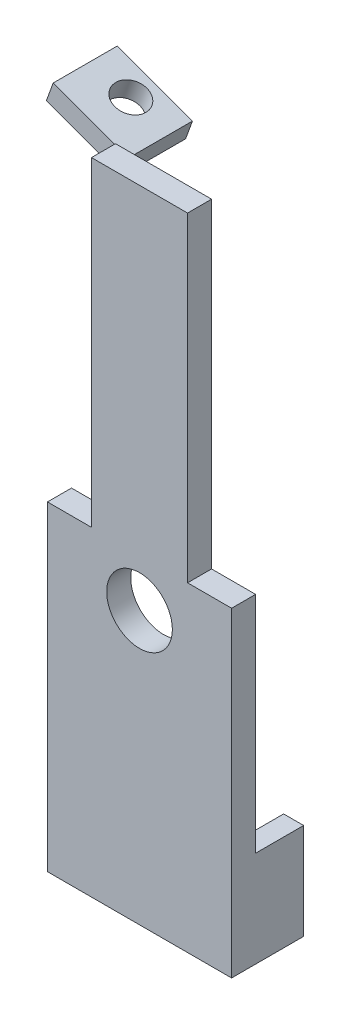
ISO-10303-21;
HEADER;
FILE_DESCRIPTION(('STEP AP214'),'2;1');
FILE_NAME('part.step','',(''),(''),'','','');
FILE_SCHEMA(('AUTOMOTIVE_DESIGN { 1 0 10303 214 1 1 1 1 }'));
ENDSEC;
DATA;
#1=APPLICATION_CONTEXT('core data for automotive mechanical design processes');
#2=APPLICATION_PROTOCOL_DEFINITION('international standard','automotive_design',2000,#1);
#3=PRODUCT_CONTEXT('',#1,'mechanical');
#4=PRODUCT('Part','Part','',(#3));
#5=PRODUCT_RELATED_PRODUCT_CATEGORY('part','',(#4));
#6=PRODUCT_DEFINITION_FORMATION('','',#4);
#7=PRODUCT_DEFINITION_CONTEXT('part definition',#1,'design');
#8=PRODUCT_DEFINITION('design','',#6,#7);
#9=PRODUCT_DEFINITION_SHAPE('','',#8);
#10=(LENGTH_UNIT() NAMED_UNIT(*) SI_UNIT(.MILLI.,.METRE.));
#11=(NAMED_UNIT(*) PLANE_ANGLE_UNIT() SI_UNIT($,.RADIAN.));
#12=(NAMED_UNIT(*) SI_UNIT($,.STERADIAN.) SOLID_ANGLE_UNIT());
#13=UNCERTAINTY_MEASURE_WITH_UNIT(LENGTH_MEASURE(1.E-05),#10,'distance_accuracy_value','');
#14=(GEOMETRIC_REPRESENTATION_CONTEXT(3) GLOBAL_UNCERTAINTY_ASSIGNED_CONTEXT((#13)) GLOBAL_UNIT_ASSIGNED_CONTEXT((#10,
#11,#12)) REPRESENTATION_CONTEXT('',''));
#15=CARTESIAN_POINT('',(0.,0.,0.));
#16=DIRECTION('',(0.,0.,1.));
#17=DIRECTION('',(1.,0.,0.));
#18=AXIS2_PLACEMENT_3D('',#15,#16,#17);
#19=CARTESIAN_POINT('',(-11.5,40.,-3.));
#20=DIRECTION('',(0.,1.,0.));
#21=DIRECTION('',(-1.,0.,0.));
#22=AXIS2_PLACEMENT_3D('',#19,#20,#21);
#23=PLANE('',#22);
#24=DIRECTION('',(0.,0.,1.));
#25=VECTOR('',#24,1.);
#26=CARTESIAN_POINT('',(-6.00000000000001,40.,-3.));
#27=LINE('',#26,#25);
#28=CARTESIAN_POINT('',(-6.00000000000001,40.,-3.));
#29=VERTEX_POINT('',#28);
#30=CARTESIAN_POINT('',(-6.00000000000001,40.,0.));
#31=VERTEX_POINT('',#30);
#32=EDGE_CURVE('E202',#29,#31,#27,.T.);
#33=ORIENTED_EDGE('',*,*,#32,.F.);
#34=DIRECTION('',(-1.,0.,0.));
#35=VECTOR('',#34,1.);
#36=CARTESIAN_POINT('',(-11.5,40.,-3.));
#37=LINE('',#36,#35);
#38=CARTESIAN_POINT('',(-11.5,40.,-3.));
#39=VERTEX_POINT('',#38);
#40=EDGE_CURVE('E246',#29,#39,#37,.T.);
#41=ORIENTED_EDGE('',*,*,#40,.T.);
#42=DIRECTION('',(0.,0.,1.));
#43=VECTOR('',#42,1.);
#44=CARTESIAN_POINT('',(-11.5,40.,-3.));
#45=LINE('',#44,#43);
#46=CARTESIAN_POINT('',(-11.5,40.,0.));
#47=VERTEX_POINT('',#46);
#48=EDGE_CURVE('E11',#39,#47,#45,.T.);
#49=ORIENTED_EDGE('',*,*,#48,.T.);
#50=DIRECTION('',(-1.,0.,0.));
#51=VECTOR('',#50,1.);
#52=CARTESIAN_POINT('',(-11.5,40.,0.));
#53=LINE('',#52,#51);
#54=EDGE_CURVE('E257',#31,#47,#53,.T.);
#55=ORIENTED_EDGE('',*,*,#54,.F.);
#56=EDGE_LOOP('',(#33,#41,#49,#55));
#57=FACE_BOUND('',#56,.T.);
#58=ADVANCED_FACE('F33',(#57),#23,.T.);
#59=CARTESIAN_POINT('',(-11.5,0.,-3.));
#60=DIRECTION('',(-1.,0.,0.));
#61=DIRECTION('',(0.,-1.,0.));
#62=AXIS2_PLACEMENT_3D('',#59,#60,#61);
#63=PLANE('',#62);
#64=DIRECTION('',(0.,-1.,0.));
#65=VECTOR('',#64,1.);
#66=CARTESIAN_POINT('',(-11.5,0.,0.));
#67=LINE('',#66,#65);
#68=CARTESIAN_POINT('',(-11.5,0.,0.));
#69=VERTEX_POINT('',#68);
#70=EDGE_CURVE('E235',#47,#69,#67,.T.);
#71=ORIENTED_EDGE('',*,*,#70,.F.);
#72=ORIENTED_EDGE('',*,*,#48,.F.);
#73=DIRECTION('',(0.,-1.,0.));
#74=VECTOR('',#73,1.);
#75=CARTESIAN_POINT('',(-11.5,0.,-3.));
#76=LINE('',#75,#74);
#77=CARTESIAN_POINT('',(-11.5,0.,-3.));
#78=VERTEX_POINT('',#77);
#79=EDGE_CURVE('E238',#39,#78,#76,.T.);
#80=ORIENTED_EDGE('',*,*,#79,.T.);
#81=DIRECTION('',(0.,0.,1.));
#82=VECTOR('',#81,1.);
#83=CARTESIAN_POINT('',(-11.5,0.,-3.));
#84=LINE('',#83,#82);
#85=EDGE_CURVE('E37',#78,#69,#84,.T.);
#86=ORIENTED_EDGE('',*,*,#85,.T.);
#87=EDGE_LOOP('',(#71,#72,#80,#86));
#88=FACE_BOUND('',#87,.T.);
#89=ADVANCED_FACE('F35',(#88),#63,.T.);
#90=DIRECTION('',(0.,0.,-1.));
#91=VECTOR('',#90,1.);
#92=CARTESIAN_POINT('',(5.99999999999999,40.,-3.));
#93=LINE('',#92,#91);
#94=CARTESIAN_POINT('',(5.99999999999999,40.,0.));
#95=VERTEX_POINT('',#94);
#96=CARTESIAN_POINT('',(5.99999999999999,40.,-3.));
#97=VERTEX_POINT('',#96);
#98=EDGE_CURVE('E207',#95,#97,#93,.T.);
#99=ORIENTED_EDGE('',*,*,#98,.F.);
#100=CARTESIAN_POINT('',(11.5,40.,0.));
#101=VERTEX_POINT('',#100);
#102=EDGE_CURVE('E242',#101,#95,#53,.T.);
#103=ORIENTED_EDGE('',*,*,#102,.F.);
#104=DIRECTION('',(0.,0.,1.));
#105=VECTOR('',#104,1.);
#106=CARTESIAN_POINT('',(11.5,40.,-3.));
#107=LINE('',#106,#105);
#108=CARTESIAN_POINT('',(11.5,40.,-3.));
#109=VERTEX_POINT('',#108);
#110=EDGE_CURVE('E42',#109,#101,#107,.T.);
#111=ORIENTED_EDGE('',*,*,#110,.F.);
#112=EDGE_CURVE('E247',#109,#97,#37,.T.);
#113=ORIENTED_EDGE('',*,*,#112,.T.);
#114=EDGE_LOOP('',(#99,#103,#111,#113));
#115=FACE_BOUND('',#114,.T.);
#116=ADVANCED_FACE('F296',(#115),#23,.T.);
#117=CARTESIAN_POINT('',(11.5,0.,-3.));
#118=DIRECTION('',(1.,0.,0.));
#119=DIRECTION('',(0.,1.,0.));
#120=AXIS2_PLACEMENT_3D('',#117,#118,#119);
#121=PLANE('',#120);
#122=DIRECTION('',(0.,1.,0.));
#123=VECTOR('',#122,1.);
#124=CARTESIAN_POINT('',(11.5,0.,0.));
#125=LINE('',#124,#123);
#126=CARTESIAN_POINT('',(11.5,0.,0.));
#127=VERTEX_POINT('',#126);
#128=EDGE_CURVE('E254',#127,#101,#125,.T.);
#129=ORIENTED_EDGE('',*,*,#128,.F.);
#130=DIRECTION('',(0.,0.,1.));
#131=VECTOR('',#130,1.);
#132=CARTESIAN_POINT('',(11.5,0.,-3.));
#133=LINE('',#132,#131);
#134=CARTESIAN_POINT('',(11.5,0.,-9.));
#135=VERTEX_POINT('',#134);
#136=EDGE_CURVE('E260',#135,#127,#133,.T.);
#137=ORIENTED_EDGE('',*,*,#136,.F.);
#138=DIRECTION('',(0.,-1.,0.));
#139=VECTOR('',#138,1.);
#140=CARTESIAN_POINT('',(11.5,0.,-9.));
#141=LINE('',#140,#139);
#142=CARTESIAN_POINT('',(11.5,12.,-9.));
#143=VERTEX_POINT('',#142);
#144=EDGE_CURVE('E182',#143,#135,#141,.T.);
#145=ORIENTED_EDGE('',*,*,#144,.F.);
#146=DIRECTION('',(0.,0.,1.));
#147=VECTOR('',#146,1.);
#148=CARTESIAN_POINT('',(11.5,12.,-9.));
#149=LINE('',#148,#147);
#150=CARTESIAN_POINT('',(11.5,12.,-3.));
#151=VERTEX_POINT('',#150);
#152=EDGE_CURVE('E190',#143,#151,#149,.T.);
#153=ORIENTED_EDGE('',*,*,#152,.T.);
#154=DIRECTION('',(0.,1.,0.));
#155=VECTOR('',#154,1.);
#156=CARTESIAN_POINT('',(11.5,0.,-3.));
#157=LINE('',#156,#155);
#158=EDGE_CURVE('E244',#151,#109,#157,.T.);
#159=ORIENTED_EDGE('',*,*,#158,.T.);
#160=ORIENTED_EDGE('',*,*,#110,.T.);
#161=EDGE_LOOP('',(#129,#137,#145,#153,#159,#160));
#162=FACE_BOUND('',#161,.T.);
#163=ADVANCED_FACE('F291',(#162),#121,.T.);
#164=CARTESIAN_POINT('',(-11.5,0.,-3.));
#165=DIRECTION('',(0.,-1.,0.));
#166=DIRECTION('',(1.,0.,0.));
#167=AXIS2_PLACEMENT_3D('',#164,#165,#166);
#168=PLANE('',#167);
#169=DIRECTION('',(1.,0.,0.));
#170=VECTOR('',#169,1.);
#171=CARTESIAN_POINT('',(-11.5,0.,0.));
#172=LINE('',#171,#170);
#173=EDGE_CURVE('E251',#69,#127,#172,.T.);
#174=ORIENTED_EDGE('',*,*,#173,.F.);
#175=ORIENTED_EDGE('',*,*,#85,.F.);
#176=DIRECTION('',(1.,0.,0.));
#177=VECTOR('',#176,1.);
#178=CARTESIAN_POINT('',(-11.5,0.,-3.));
#179=LINE('',#178,#177);
#180=CARTESIAN_POINT('',(9.,0.,-3.));
#181=VERTEX_POINT('',#180);
#182=EDGE_CURVE('E241',#78,#181,#179,.T.);
#183=ORIENTED_EDGE('',*,*,#182,.T.);
#184=DIRECTION('',(0.,0.,1.));
#185=VECTOR('',#184,1.);
#186=CARTESIAN_POINT('',(9.,0.,-9.));
#187=LINE('',#186,#185);
#188=CARTESIAN_POINT('',(9.,0.,-9.));
#189=VERTEX_POINT('',#188);
#190=EDGE_CURVE('E199',#189,#181,#187,.T.);
#191=ORIENTED_EDGE('',*,*,#190,.F.);
#192=DIRECTION('',(-1.,0.,0.));
#193=VECTOR('',#192,1.);
#194=CARTESIAN_POINT('',(11.5,0.,-9.));
#195=LINE('',#194,#193);
#196=EDGE_CURVE('E185',#135,#189,#195,.T.);
#197=ORIENTED_EDGE('',*,*,#196,.F.);
#198=ORIENTED_EDGE('',*,*,#136,.T.);
#199=EDGE_LOOP('',(#174,#175,#183,#191,#197,#198));
#200=FACE_BOUND('',#199,.T.);
#201=ADVANCED_FACE('F269',(#200),#168,.T.);
#202=CARTESIAN_POINT('',(0.,0.,-3.));
#203=DIRECTION('',(0.,0.,-1.));
#204=DIRECTION('',(-1.,0.,0.));
#205=AXIS2_PLACEMENT_3D('',#202,#203,#204);
#206=PLANE('',#205);
#207=DIRECTION('',(0.939692620785908,-0.342020143325669,0.));
#208=VECTOR('',#207,1.);
#209=CARTESIAN_POINT('',(-4.38603393365398,79.2568302295213,-3.));
#210=LINE('',#209,#208);
#211=CARTESIAN_POINT('',(-6.00000000000003,79.844265836787,-3.));
#212=VERTEX_POINT('',#211);
#213=CARTESIAN_POINT('',(-4.38603393365398,79.2568302295213,-3.));
#214=VERTEX_POINT('',#213);
#215=EDGE_CURVE('E160',#212,#214,#210,.T.);
#216=ORIENTED_EDGE('',*,*,#215,.F.);
#217=DIRECTION('',(0.,-1.,0.));
#218=VECTOR('',#217,1.);
#219=CARTESIAN_POINT('',(-6.00000000000003,80.,-3.));
#220=LINE('',#219,#218);
#221=CARTESIAN_POINT('',(-6.00000000000003,80.,-3.));
#222=VERTEX_POINT('',#221);
#223=EDGE_CURVE('E218',#222,#212,#220,.T.);
#224=ORIENTED_EDGE('',*,*,#223,.F.);
#225=DIRECTION('',(-1.,0.,0.));
#226=VECTOR('',#225,1.);
#227=CARTESIAN_POINT('',(-6.00000000000003,80.,-3.));
#228=LINE('',#227,#226);
#229=CARTESIAN_POINT('',(5.99999999999997,80.,-3.));
#230=VERTEX_POINT('',#229);
#231=EDGE_CURVE('E211',#230,#222,#228,.T.);
#232=ORIENTED_EDGE('',*,*,#231,.F.);
#233=DIRECTION('',(0.,-1.,0.));
#234=VECTOR('',#233,1.);
#235=CARTESIAN_POINT('',(5.99999999999997,80.,-3.));
#236=LINE('',#235,#234);
#237=EDGE_CURVE('E221',#230,#97,#236,.T.);
#238=ORIENTED_EDGE('',*,*,#237,.T.);
#239=ORIENTED_EDGE('',*,*,#112,.F.);
#240=ORIENTED_EDGE('',*,*,#158,.F.);
#241=DIRECTION('',(1.,0.,0.));
#242=VECTOR('',#241,1.);
#243=CARTESIAN_POINT('',(11.5,12.,-3.));
#244=LINE('',#243,#242);
#245=CARTESIAN_POINT('',(9.,12.,-3.));
#246=VERTEX_POINT('',#245);
#247=EDGE_CURVE('E176',#246,#151,#244,.T.);
#248=ORIENTED_EDGE('',*,*,#247,.F.);
#249=DIRECTION('',(0.,1.,0.));
#250=VECTOR('',#249,1.);
#251=CARTESIAN_POINT('',(9.,0.,-3.));
#252=LINE('',#251,#250);
#253=EDGE_CURVE('E58',#181,#246,#252,.T.);
#254=ORIENTED_EDGE('',*,*,#253,.F.);
#255=ORIENTED_EDGE('',*,*,#182,.F.);
#256=ORIENTED_EDGE('',*,*,#79,.F.);
#257=ORIENTED_EDGE('',*,*,#40,.F.);
#258=CARTESIAN_POINT('',(-6.00000000000002,77.1838214055972,-3.));
#259=VERTEX_POINT('',#258);
#260=EDGE_CURVE('E213',#259,#29,#220,.T.);
#261=ORIENTED_EDGE('',*,*,#260,.F.);
#262=DIRECTION('',(0.939692620785908,-0.342020143325669,0.));
#263=VECTOR('',#262,1.);
#264=CARTESIAN_POINT('',(-5.24108429196815,76.9075986775565,-3.));
#265=LINE('',#264,#263);
#266=CARTESIAN_POINT('',(-5.24108429196815,76.9075986775565,-3.));
#267=VERTEX_POINT('',#266);
#268=EDGE_CURVE('E312',#259,#267,#265,.T.);
#269=ORIENTED_EDGE('',*,*,#268,.T.);
#270=DIRECTION('',(-0.342020143325669,-0.939692620785908,0.));
#271=VECTOR('',#270,1.);
#272=CARTESIAN_POINT('',(-4.38603393365398,79.2568302295213,-3.));
#273=LINE('',#272,#271);
#274=EDGE_CURVE('E178',#214,#267,#273,.T.);
#275=ORIENTED_EDGE('',*,*,#274,.F.);
#276=EDGE_LOOP('',(#216,#224,#232,#238,#239,#240,#248,#254,#255,#256,#257,#261,#269,#275));
#277=FACE_BOUND('',#276,.T.);
#278=CARTESIAN_POINT('',(0.,34.,-3.));
#279=DIRECTION('',(0.,0.,1.));
#280=DIRECTION('',(1.,0.,0.));
#281=AXIS2_PLACEMENT_3D('',#278,#279,#280);
#282=CIRCLE('',#281,4.1);
#283=CARTESIAN_POINT('',(4.1,34.,-3.));
#284=VERTEX_POINT('',#283);
#285=EDGE_CURVE('E232',#284,#284,#282,.T.);
#286=ORIENTED_EDGE('',*,*,#285,.T.);
#287=EDGE_LOOP('',(#286));
#288=FACE_BOUND('',#287,.T.);
#289=ADVANCED_FACE('F277',(#277,#288),#206,.T.);
#290=CARTESIAN_POINT('',(0.,0.,0.));
#291=DIRECTION('',(0.,0.,-1.));
#292=DIRECTION('',(-1.,0.,0.));
#293=AXIS2_PLACEMENT_3D('',#290,#291,#292);
#294=PLANE('',#293);
#295=CARTESIAN_POINT('',(0.,34.,0.));
#296=DIRECTION('',(0.,0.,1.));
#297=DIRECTION('',(1.,0.,0.));
#298=AXIS2_PLACEMENT_3D('',#295,#296,#297);
#299=CIRCLE('',#298,4.1);
#300=CARTESIAN_POINT('',(4.1,34.,0.));
#301=VERTEX_POINT('',#300);
#302=EDGE_CURVE('E231',#301,#301,#299,.T.);
#303=ORIENTED_EDGE('',*,*,#302,.F.);
#304=EDGE_LOOP('',(#303));
#305=FACE_BOUND('',#304,.T.);
#306=ORIENTED_EDGE('',*,*,#70,.T.);
#307=ORIENTED_EDGE('',*,*,#173,.T.);
#308=ORIENTED_EDGE('',*,*,#128,.T.);
#309=ORIENTED_EDGE('',*,*,#102,.T.);
#310=DIRECTION('',(0.,-1.,0.));
#311=VECTOR('',#310,1.);
#312=CARTESIAN_POINT('',(5.99999999999997,80.,0.));
#313=LINE('',#312,#311);
#314=CARTESIAN_POINT('',(5.99999999999997,80.,0.));
#315=VERTEX_POINT('',#314);
#316=EDGE_CURVE('E225',#315,#95,#313,.T.);
#317=ORIENTED_EDGE('',*,*,#316,.F.);
#318=DIRECTION('',(1.,0.,0.));
#319=VECTOR('',#318,1.);
#320=CARTESIAN_POINT('',(-6.00000000000003,80.,0.));
#321=LINE('',#320,#319);
#322=CARTESIAN_POINT('',(-6.00000000000003,80.,0.));
#323=VERTEX_POINT('',#322);
#324=EDGE_CURVE('E206',#323,#315,#321,.T.);
#325=ORIENTED_EDGE('',*,*,#324,.F.);
#326=DIRECTION('',(0.,-1.,0.));
#327=VECTOR('',#326,1.);
#328=CARTESIAN_POINT('',(-6.00000000000003,80.,0.));
#329=LINE('',#328,#327);
#330=EDGE_CURVE('E228',#323,#31,#329,.T.);
#331=ORIENTED_EDGE('',*,*,#330,.T.);
#332=ORIENTED_EDGE('',*,*,#54,.T.);
#333=EDGE_LOOP('',(#306,#307,#308,#309,#317,#325,#331,#332));
#334=FACE_BOUND('',#333,.T.);
#335=ADVANCED_FACE('F271',(#305,#334),#294,.F.);
#336=CARTESIAN_POINT('',(0.,34.,-3.));
#337=DIRECTION('',(0.,0.,1.));
#338=DIRECTION('',(1.,0.,0.));
#339=AXIS2_PLACEMENT_3D('',#336,#337,#338);
#340=CYLINDRICAL_SURFACE('',#339,4.1);
#341=ORIENTED_EDGE('',*,*,#285,.F.);
#342=EDGE_LOOP('',(#341));
#343=FACE_BOUND('',#342,.T.);
#344=ORIENTED_EDGE('',*,*,#302,.T.);
#345=EDGE_LOOP('',(#344));
#346=FACE_BOUND('',#345,.T.);
#347=ADVANCED_FACE('F370',(#343,#346),#340,.F.);
#348=CARTESIAN_POINT('',(-6.00000000000003,80.,-3.));
#349=DIRECTION('',(1.,0.,0.));
#350=DIRECTION('',(0.,1.,0.));
#351=AXIS2_PLACEMENT_3D('',#348,#349,#350);
#352=PLANE('',#351);
#353=ORIENTED_EDGE('',*,*,#32,.T.);
#354=ORIENTED_EDGE('',*,*,#330,.F.);
#355=DIRECTION('',(0.,0.,1.));
#356=VECTOR('',#355,1.);
#357=CARTESIAN_POINT('',(-6.00000000000003,80.,-3.));
#358=LINE('',#357,#356);
#359=EDGE_CURVE('E203',#222,#323,#358,.T.);
#360=ORIENTED_EDGE('',*,*,#359,.F.);
#361=ORIENTED_EDGE('',*,*,#223,.T.);
#362=EDGE_CURVE('E222',#212,#259,#220,.T.);
#363=ORIENTED_EDGE('',*,*,#362,.T.);
#364=ORIENTED_EDGE('',*,*,#260,.T.);
#365=EDGE_LOOP('',(#353,#354,#360,#361,#363,#364));
#366=FACE_BOUND('',#365,.T.);
#367=ADVANCED_FACE('F308',(#366),#352,.F.);
#368=CARTESIAN_POINT('',(5.99999999999997,80.,-3.));
#369=DIRECTION('',(-1.,0.,0.));
#370=DIRECTION('',(0.,-1.,0.));
#371=AXIS2_PLACEMENT_3D('',#368,#369,#370);
#372=PLANE('',#371);
#373=ORIENTED_EDGE('',*,*,#98,.T.);
#374=ORIENTED_EDGE('',*,*,#237,.F.);
#375=DIRECTION('',(0.,0.,-1.));
#376=VECTOR('',#375,1.);
#377=CARTESIAN_POINT('',(5.99999999999997,80.,-3.));
#378=LINE('',#377,#376);
#379=EDGE_CURVE('E209',#315,#230,#378,.T.);
#380=ORIENTED_EDGE('',*,*,#379,.F.);
#381=ORIENTED_EDGE('',*,*,#316,.T.);
#382=EDGE_LOOP('',(#373,#374,#380,#381));
#383=FACE_BOUND('',#382,.T.);
#384=ADVANCED_FACE('F300',(#383),#372,.F.);
#385=CARTESIAN_POINT('',(0.,80.,0.));
#386=DIRECTION('',(0.,1.,0.));
#387=DIRECTION('',(0.,0.,1.));
#388=AXIS2_PLACEMENT_3D('',#385,#386,#387);
#389=PLANE('',#388);
#390=ORIENTED_EDGE('',*,*,#359,.T.);
#391=ORIENTED_EDGE('',*,*,#324,.T.);
#392=ORIENTED_EDGE('',*,*,#379,.T.);
#393=ORIENTED_EDGE('',*,*,#231,.T.);
#394=EDGE_LOOP('',(#390,#391,#392,#393));
#395=FACE_BOUND('',#394,.T.);
#396=ADVANCED_FACE('F306',(#395),#389,.T.);
#397=CARTESIAN_POINT('',(9.,0.,-9.));
#398=DIRECTION('',(1.,0.,0.));
#399=DIRECTION('',(0.,0.,-1.));
#400=AXIS2_PLACEMENT_3D('',#397,#398,#399);
#401=PLANE('',#400);
#402=ORIENTED_EDGE('',*,*,#253,.T.);
#403=DIRECTION('',(0.,0.,1.));
#404=VECTOR('',#403,1.);
#405=CARTESIAN_POINT('',(9.,12.,-9.));
#406=LINE('',#405,#404);
#407=CARTESIAN_POINT('',(9.,12.,-9.));
#408=VERTEX_POINT('',#407);
#409=EDGE_CURVE('E196',#408,#246,#406,.T.);
#410=ORIENTED_EDGE('',*,*,#409,.F.);
#411=DIRECTION('',(0.,1.,0.));
#412=VECTOR('',#411,1.);
#413=CARTESIAN_POINT('',(9.,0.,-9.));
#414=LINE('',#413,#412);
#415=EDGE_CURVE('E187',#189,#408,#414,.T.);
#416=ORIENTED_EDGE('',*,*,#415,.F.);
#417=ORIENTED_EDGE('',*,*,#190,.T.);
#418=EDGE_LOOP('',(#402,#410,#416,#417));
#419=FACE_BOUND('',#418,.T.);
#420=ADVANCED_FACE('F283',(#419),#401,.F.);
#421=CARTESIAN_POINT('',(11.5,12.,-9.));
#422=DIRECTION('',(0.,-1.,0.));
#423=DIRECTION('',(0.,0.,-1.));
#424=AXIS2_PLACEMENT_3D('',#421,#422,#423);
#425=PLANE('',#424);
#426=ORIENTED_EDGE('',*,*,#247,.T.);
#427=ORIENTED_EDGE('',*,*,#152,.F.);
#428=DIRECTION('',(1.,0.,0.));
#429=VECTOR('',#428,1.);
#430=CARTESIAN_POINT('',(11.5,12.,-9.));
#431=LINE('',#430,#429);
#432=EDGE_CURVE('E189',#408,#143,#431,.T.);
#433=ORIENTED_EDGE('',*,*,#432,.F.);
#434=ORIENTED_EDGE('',*,*,#409,.T.);
#435=EDGE_LOOP('',(#426,#427,#433,#434));
#436=FACE_BOUND('',#435,.T.);
#437=ADVANCED_FACE('F384',(#436),#425,.F.);
#438=CARTESIAN_POINT('',(0.,0.,-9.));
#439=DIRECTION('',(0.,0.,1.));
#440=DIRECTION('',(1.,0.,0.));
#441=AXIS2_PLACEMENT_3D('',#438,#439,#440);
#442=PLANE('',#441);
#443=ORIENTED_EDGE('',*,*,#144,.T.);
#444=ORIENTED_EDGE('',*,*,#196,.T.);
#445=ORIENTED_EDGE('',*,*,#415,.T.);
#446=ORIENTED_EDGE('',*,*,#432,.T.);
#447=EDGE_LOOP('',(#443,#444,#445,#446));
#448=FACE_BOUND('',#447,.T.);
#449=ADVANCED_FACE('F287',(#448),#442,.F.);
#450=CARTESIAN_POINT('',(-4.38603393365398,79.2568302295213,-3.));
#451=DIRECTION('',(0.,0.,-1.));
#452=DIRECTION('',(-1.,0.,0.));
#453=AXIS2_PLACEMENT_3D('',#450,#451,#452);
#454=PLANE('',#453);
#455=CARTESIAN_POINT('',(-14.6380104998272,80.3278001108132,-3.));
#456=VERTEX_POINT('',#455);
#457=EDGE_CURVE('E50',#456,#259,#265,.T.);
#458=ORIENTED_EDGE('',*,*,#457,.T.);
#459=ORIENTED_EDGE('',*,*,#362,.F.);
#460=CARTESIAN_POINT('',(-13.7829601415131,82.677031662778,-3.));
#461=VERTEX_POINT('',#460);
#462=EDGE_CURVE('E331',#461,#212,#210,.T.);
#463=ORIENTED_EDGE('',*,*,#462,.F.);
#464=DIRECTION('',(-0.342020143325669,-0.939692620785908,0.));
#465=VECTOR('',#464,1.);
#466=CARTESIAN_POINT('',(-13.7829601415131,82.677031662778,-3.));
#467=LINE('',#466,#465);
#468=EDGE_CURVE('E156',#461,#456,#467,.T.);
#469=ORIENTED_EDGE('',*,*,#468,.T.);
#470=EDGE_LOOP('',(#458,#459,#463,#469));
#471=FACE_BOUND('',#470,.T.);
#472=ADVANCED_FACE('F390',(#471),#454,.F.);
#473=CARTESIAN_POINT('',(-4.38603393365398,79.2568302295213,-11.));
#474=DIRECTION('',(0.,0.,1.));
#475=DIRECTION('',(1.,0.,0.));
#476=AXIS2_PLACEMENT_3D('',#473,#474,#475);
#477=PLANE('',#476);
#478=DIRECTION('',(-0.939692620785908,0.342020143325669,0.));
#479=VECTOR('',#478,1.);
#480=CARTESIAN_POINT('',(-5.24108429196815,76.9075986775565,-11.));
#481=LINE('',#480,#479);
#482=CARTESIAN_POINT('',(-5.24108429196815,76.9075986775565,-11.));
#483=VERTEX_POINT('',#482);
#484=CARTESIAN_POINT('',(-14.6380104998272,80.3278001108132,-11.));
#485=VERTEX_POINT('',#484);
#486=EDGE_CURVE('E174',#483,#485,#481,.T.);
#487=ORIENTED_EDGE('',*,*,#486,.T.);
#488=DIRECTION('',(-0.342020143325669,-0.939692620785908,0.));
#489=VECTOR('',#488,1.);
#490=CARTESIAN_POINT('',(-13.7829601415131,82.677031662778,-11.));
#491=LINE('',#490,#489);
#492=CARTESIAN_POINT('',(-13.7829601415131,82.677031662778,-11.));
#493=VERTEX_POINT('',#492);
#494=EDGE_CURVE('E154',#493,#485,#491,.T.);
#495=ORIENTED_EDGE('',*,*,#494,.F.);
#496=DIRECTION('',(-0.939692620785908,0.342020143325669,0.));
#497=VECTOR('',#496,1.);
#498=CARTESIAN_POINT('',(-4.38603393365398,79.2568302295213,-11.));
#499=LINE('',#498,#497);
#500=CARTESIAN_POINT('',(-4.38603393365398,79.2568302295213,-11.));
#501=VERTEX_POINT('',#500);
#502=EDGE_CURVE('E161',#501,#493,#499,.T.);
#503=ORIENTED_EDGE('',*,*,#502,.F.);
#504=DIRECTION('',(-0.342020143325669,-0.939692620785908,0.));
#505=VECTOR('',#504,1.);
#506=CARTESIAN_POINT('',(-4.38603393365398,79.2568302295213,-11.));
#507=LINE('',#506,#505);
#508=EDGE_CURVE('E321',#501,#483,#507,.T.);
#509=ORIENTED_EDGE('',*,*,#508,.T.);
#510=EDGE_LOOP('',(#487,#495,#503,#509));
#511=FACE_BOUND('',#510,.T.);
#512=ADVANCED_FACE('F172',(#511),#477,.F.);
#513=CARTESIAN_POINT('',(-13.7829601415131,82.677031662778,-11.));
#514=DIRECTION('',(0.939692620785908,-0.342020143325669,0.));
#515=DIRECTION('',(0.342020143325669,0.939692620785908,0.));
#516=AXIS2_PLACEMENT_3D('',#513,#514,#515);
#517=PLANE('',#516);
#518=DIRECTION('',(0.,0.,1.));
#519=VECTOR('',#518,1.);
#520=CARTESIAN_POINT('',(-14.6380104998272,80.3278001108132,-11.));
#521=LINE('',#520,#519);
#522=EDGE_CURVE('E315',#485,#456,#521,.T.);
#523=ORIENTED_EDGE('',*,*,#522,.T.);
#524=ORIENTED_EDGE('',*,*,#468,.F.);
#525=DIRECTION('',(0.,0.,1.));
#526=VECTOR('',#525,1.);
#527=CARTESIAN_POINT('',(-13.7829601415131,82.677031662778,-11.));
#528=LINE('',#527,#526);
#529=EDGE_CURVE('E150',#493,#461,#528,.T.);
#530=ORIENTED_EDGE('',*,*,#529,.F.);
#531=ORIENTED_EDGE('',*,*,#494,.T.);
#532=EDGE_LOOP('',(#523,#524,#530,#531));
#533=FACE_BOUND('',#532,.T.);
#534=ADVANCED_FACE('F152',(#533),#517,.F.);
#535=CARTESIAN_POINT('',(-4.38603393365398,79.2568302295213,-11.));
#536=DIRECTION('',(-0.939692620785908,0.342020143325669,0.));
#537=DIRECTION('',(-0.342020143325669,-0.939692620785908,0.));
#538=AXIS2_PLACEMENT_3D('',#535,#536,#537);
#539=PLANE('',#538);
#540=DIRECTION('',(0.,0.,-1.));
#541=VECTOR('',#540,1.);
#542=CARTESIAN_POINT('',(-5.24108429196815,76.9075986775565,-11.));
#543=LINE('',#542,#541);
#544=EDGE_CURVE('E170',#267,#483,#543,.T.);
#545=ORIENTED_EDGE('',*,*,#544,.T.);
#546=ORIENTED_EDGE('',*,*,#508,.F.);
#547=DIRECTION('',(0.,0.,-1.));
#548=VECTOR('',#547,1.);
#549=CARTESIAN_POINT('',(-4.38603393365398,79.2568302295213,-11.));
#550=LINE('',#549,#548);
#551=EDGE_CURVE('E166',#214,#501,#550,.T.);
#552=ORIENTED_EDGE('',*,*,#551,.F.);
#553=ORIENTED_EDGE('',*,*,#274,.T.);
#554=EDGE_LOOP('',(#545,#546,#552,#553));
#555=FACE_BOUND('',#554,.T.);
#556=ADVANCED_FACE('F323',(#555),#539,.F.);
#557=CARTESIAN_POINT('',(24.9595857215594,68.5758981689264,0.));
#558=DIRECTION('',(0.342020143325669,0.939692620785908,0.));
#559=DIRECTION('',(-0.939692620785908,0.342020143325669,0.));
#560=AXIS2_PLACEMENT_3D('',#557,#558,#559);
#561=PLANE('',#560);
#562=CARTESIAN_POINT('',(-9.08449703758352,80.9669309461497,-8.));
#563=DIRECTION('',(0.342020143325669,0.939692620785908,0.));
#564=DIRECTION('',(-0.939692620785908,0.342020143325669,0.));
#565=AXIS2_PLACEMENT_3D('',#562,#563,#564);
#566=CIRCLE('',#565,2.);
#567=CARTESIAN_POINT('',(-10.9638822791553,81.650971232801,-8.));
#568=VERTEX_POINT('',#567);
#569=EDGE_CURVE('E325',#568,#568,#566,.T.);
#570=ORIENTED_EDGE('',*,*,#569,.F.);
#571=EDGE_LOOP('',(#570));
#572=FACE_BOUND('',#571,.T.);
#573=ORIENTED_EDGE('',*,*,#502,.T.);
#574=ORIENTED_EDGE('',*,*,#529,.T.);
#575=ORIENTED_EDGE('',*,*,#462,.T.);
#576=ORIENTED_EDGE('',*,*,#215,.T.);
#577=ORIENTED_EDGE('',*,*,#551,.T.);
#578=EDGE_LOOP('',(#573,#574,#575,#576,#577));
#579=FACE_BOUND('',#578,.T.);
#580=ADVANCED_FACE('F164',(#572,#579),#561,.T.);
#581=CARTESIAN_POINT('',(24.1045353632452,66.2266666169616,0.));
#582=DIRECTION('',(0.342020143325669,0.939692620785908,0.));
#583=DIRECTION('',(-0.939692620785908,0.342020143325669,0.));
#584=AXIS2_PLACEMENT_3D('',#581,#582,#583);
#585=PLANE('',#584);
#586=CARTESIAN_POINT('',(-9.93954739589768,78.617699394185,-8.));
#587=DIRECTION('',(-0.342020143325671,-0.939692620785908,0.));
#588=DIRECTION('',(0.939692620785908,-0.342020143325671,0.));
#589=AXIS2_PLACEMENT_3D('',#586,#587,#588);
#590=CIRCLE('',#589,2.);
#591=CARTESIAN_POINT('',(-8.06016215432586,77.9336591075336,-8.));
#592=VERTEX_POINT('',#591);
#593=EDGE_CURVE('E327',#592,#592,#590,.T.);
#594=ORIENTED_EDGE('',*,*,#593,.F.);
#595=EDGE_LOOP('',(#594));
#596=FACE_BOUND('',#595,.T.);
#597=ORIENTED_EDGE('',*,*,#486,.F.);
#598=ORIENTED_EDGE('',*,*,#544,.F.);
#599=ORIENTED_EDGE('',*,*,#268,.F.);
#600=ORIENTED_EDGE('',*,*,#457,.F.);
#601=ORIENTED_EDGE('',*,*,#522,.F.);
#602=EDGE_LOOP('',(#597,#598,#599,#600,#601));
#603=FACE_BOUND('',#602,.T.);
#604=ADVANCED_FACE('F324',(#596,#603),#585,.F.);
#605=CARTESIAN_POINT('',(-6.12695252782931,89.0927177037313,-8.));
#606=DIRECTION('',(-0.342020143325671,-0.939692620785908,0.));
#607=DIRECTION('',(0.939692620785908,-0.342020143325671,0.));
#608=AXIS2_PLACEMENT_3D('',#605,#606,#607);
#609=CYLINDRICAL_SURFACE('',#608,2.);
#610=ORIENTED_EDGE('',*,*,#569,.T.);
#611=EDGE_LOOP('',(#610));
#612=FACE_BOUND('',#611,.T.);
#613=ORIENTED_EDGE('',*,*,#593,.T.);
#614=EDGE_LOOP('',(#613));
#615=FACE_BOUND('',#614,.T.);
#616=ADVANCED_FACE('F336',(#612,#615),#609,.F.);
#617=CLOSED_SHELL('',(#58,#89,#116,#163,#201,#289,#335,#347,#367,#384,#396,#420,#437,#449,#472,
#512,#534,#556,#580,#604,#616));
#618=MANIFOLD_SOLID_BREP('B2',#617);
#619=ADVANCED_BREP_SHAPE_REPRESENTATION('',(#18,#618),#14);
#620=SHAPE_DEFINITION_REPRESENTATION(#9,#619);
ENDSEC;
END-ISO-10303-21;
